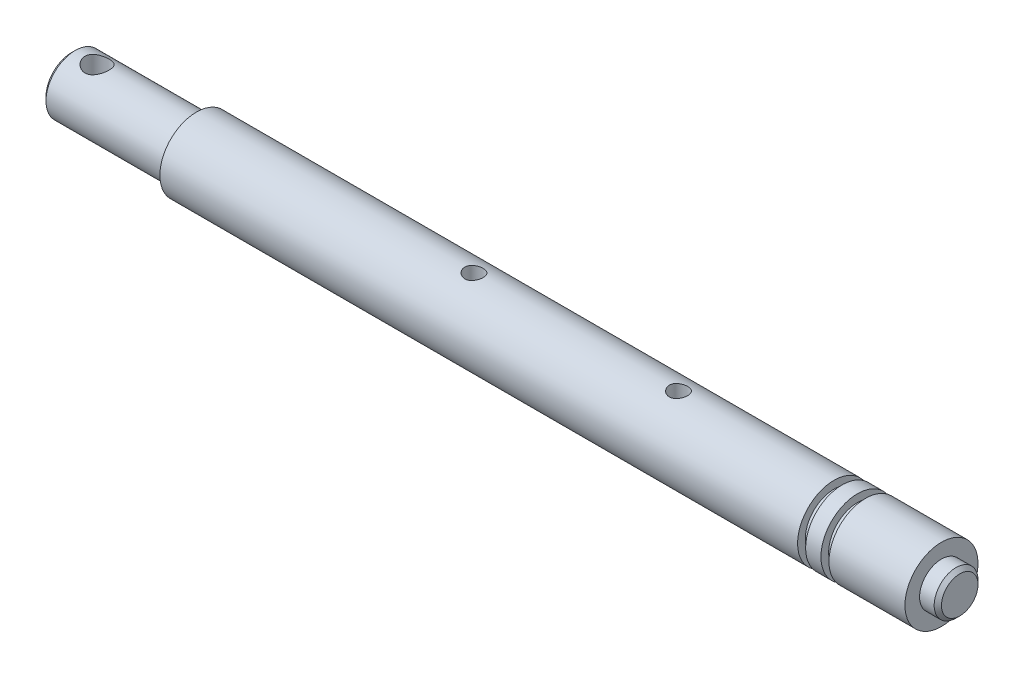
ISO-10303-21;
HEADER;
FILE_DESCRIPTION(('STEP AP214'),'2;1');
FILE_NAME('part.step','',(''),(''),'','','');
FILE_SCHEMA(('AUTOMOTIVE_DESIGN { 1 0 10303 214 1 1 1 1 }'));
ENDSEC;
DATA;
#1=APPLICATION_CONTEXT('core data for automotive mechanical design processes');
#2=APPLICATION_PROTOCOL_DEFINITION('international standard','automotive_design',2000,#1);
#3=PRODUCT_CONTEXT('',#1,'mechanical');
#4=PRODUCT('Part','Part','',(#3));
#5=PRODUCT_RELATED_PRODUCT_CATEGORY('part','',(#4));
#6=PRODUCT_DEFINITION_FORMATION('','',#4);
#7=PRODUCT_DEFINITION_CONTEXT('part definition',#1,'design');
#8=PRODUCT_DEFINITION('design','',#6,#7);
#9=PRODUCT_DEFINITION_SHAPE('','',#8);
#10=(LENGTH_UNIT() NAMED_UNIT(*) SI_UNIT(.MILLI.,.METRE.));
#11=(NAMED_UNIT(*) PLANE_ANGLE_UNIT() SI_UNIT($,.RADIAN.));
#12=(NAMED_UNIT(*) SI_UNIT($,.STERADIAN.) SOLID_ANGLE_UNIT());
#13=UNCERTAINTY_MEASURE_WITH_UNIT(LENGTH_MEASURE(1.E-05),#10,'distance_accuracy_value','');
#14=(GEOMETRIC_REPRESENTATION_CONTEXT(3) GLOBAL_UNCERTAINTY_ASSIGNED_CONTEXT((#13)) GLOBAL_UNIT_ASSIGNED_CONTEXT((#10,
#11,#12)) REPRESENTATION_CONTEXT('',''));
#15=CARTESIAN_POINT('',(0.,0.,0.));
#16=DIRECTION('',(0.,0.,1.));
#17=DIRECTION('',(1.,0.,0.));
#18=AXIS2_PLACEMENT_3D('',#15,#16,#17);
#19=CARTESIAN_POINT('',(17.1,0.,0.));
#20=DIRECTION('',(-1.,0.,0.));
#21=DIRECTION('',(0.,0.,1.));
#22=AXIS2_PLACEMENT_3D('',#19,#20,#21);
#23=CYLINDRICAL_SURFACE('',#22,4.);
#24=CARTESIAN_POINT('',(0.499999999999997,0.,0.));
#25=DIRECTION('',(1.,0.,0.));
#26=DIRECTION('',(0.,0.,-1.));
#27=AXIS2_PLACEMENT_3D('',#24,#25,#26);
#28=CIRCLE('',#27,4.);
#29=CARTESIAN_POINT('',(0.499999999999997,0.,-4.));
#30=VERTEX_POINT('',#29);
#31=EDGE_CURVE('E138',#30,#30,#28,.T.);
#32=ORIENTED_EDGE('',*,*,#31,.T.);
#33=EDGE_LOOP('',(#32));
#34=FACE_BOUND('',#33,.T.);
#35=CARTESIAN_POINT('',(3.5,-3.64383040220041,1.65));
#36=CARTESIAN_POINT('',(3.58809648022568,-3.64383945275153,1.64999056813102));
#37=CARTESIAN_POINT('',(3.67634043197359,-3.64707173267573,1.64289989177358));
#38=CARTESIAN_POINT('',(3.85028706107888,-3.65959209124688,1.61480845546373));
#39=CARTESIAN_POINT('',(3.9359821005976,-3.66889676295874,1.5937695789634));
#40=CARTESIAN_POINT('',(4.10200293813063,-3.69231325052125,1.53873536249638));
#41=CARTESIAN_POINT('',(4.1823488202186,-3.70640571161012,1.50479212400174));
#42=CARTESIAN_POINT('',(4.33618176683423,-3.73778230052357,1.42506535594207));
#43=CARTESIAN_POINT('',(4.40967054278404,-3.75506562873472,1.37928479159595));
#44=CARTESIAN_POINT('',(4.5522286878465,-3.7920553041855,1.27419856290372));
#45=CARTESIAN_POINT('',(4.62082925578021,-3.81184277704779,1.2142851824136));
#46=CARTESIAN_POINT('',(4.74735477190876,-3.85094363418238,1.08391072165483));
#47=CARTESIAN_POINT('',(4.80527565147223,-3.87025683535296,1.01344563996364));
#48=CARTESIAN_POINT('',(4.91117137130187,-3.90721575035942,0.860301943593382));
#49=CARTESIAN_POINT('',(4.95862093270616,-3.92475616703248,0.777232390113591));
#50=CARTESIAN_POINT('',(5.0386701453217,-3.95520283117798,0.603436361875857));
#51=CARTESIAN_POINT('',(5.07127626434656,-3.96811109652272,0.512713242513045));
#52=CARTESIAN_POINT('',(5.11902070665623,-3.98726403378776,0.331105172304398));
#53=CARTESIAN_POINT('',(5.13496684792324,-3.99381564337609,0.240465625184492));
#54=CARTESIAN_POINT('',(5.15154665185517,-4.0006306156112,0.0575763551498653));
#55=CARTESIAN_POINT('',(5.15218639532201,-4.00089647540932,-0.0346727137709551));
#56=CARTESIAN_POINT('',(5.13856350386341,-3.99529224160632,-0.212297380895985));
#57=CARTESIAN_POINT('',(5.1251878162829,-3.98978733384658,-0.297754665400397));
#58=CARTESIAN_POINT('',(5.08543118255224,-3.97375926025944,-0.465085845235279));
#59=CARTESIAN_POINT('',(5.05904927870932,-3.96323572489496,-0.546959476205493));
#60=CARTESIAN_POINT('',(4.99371233827982,-3.93798907731603,-0.70629560681723));
#61=CARTESIAN_POINT('',(4.95457201007513,-3.92320447216362,-0.78367197976247));
#62=CARTESIAN_POINT('',(4.8650087208134,-3.89088763760773,-0.930960489992467));
#63=CARTESIAN_POINT('',(4.8145817994967,-3.87335444442336,-1.00086999453932));
#64=CARTESIAN_POINT('',(4.69981176097137,-3.83587133640027,-1.13638530947041));
#65=CARTESIAN_POINT('',(4.63474658910128,-3.8158381454309,-1.20135746318645));
#66=CARTESIAN_POINT('',(4.49459033367843,-3.77653142784555,-1.31973838423493));
#67=CARTESIAN_POINT('',(4.4194955507367,-3.75725818494773,-1.37314286572202));
#68=CARTESIAN_POINT('',(4.25840159645269,-3.72106607156909,-1.46845339844828));
#69=CARTESIAN_POINT('',(4.17213242830735,-3.70424107982558,-1.50994179309277));
#70=CARTESIAN_POINT('',(3.99295332859411,-3.67596385006485,-1.57754508127096));
#71=CARTESIAN_POINT('',(3.90004808612619,-3.66450786071417,-1.60367071206121));
#72=CARTESIAN_POINT('',(3.71657710481502,-3.64919091711418,-1.63821320355942));
#73=CARTESIAN_POINT('',(3.62624169881714,-3.64489111171831,-1.64765569454682));
#74=CARTESIAN_POINT('',(3.4451943703014,-3.64311980380967,-1.65157101672826));
#75=CARTESIAN_POINT('',(3.35448258394072,-3.64564601607449,-1.64604885780402));
#76=CARTESIAN_POINT('',(3.18119899095053,-3.65678944366161,-1.62112710501827));
#77=CARTESIAN_POINT('',(3.09847182032539,-3.66501803861664,-1.60261202118543));
#78=CARTESIAN_POINT('',(2.93736293562003,-3.68614612916707,-1.55339580262015));
#79=CARTESIAN_POINT('',(2.85898222864834,-3.69904670212356,-1.52269185697123));
#80=CARTESIAN_POINT('',(2.70512099430436,-3.72872477858182,-1.44853902204985));
#81=CARTESIAN_POINT('',(2.62989980522076,-3.74564214050945,-1.40460979308264));
#82=CARTESIAN_POINT('',(2.48753983057027,-3.78124523189864,-1.30573455409451));
#83=CARTESIAN_POINT('',(2.42040451226488,-3.79993171387674,-1.25078384473684));
#84=CARTESIAN_POINT('',(2.29057037355329,-3.83876011670653,-1.12627542162099));
#85=CARTESIAN_POINT('',(2.22864826295128,-3.85889967217623,-1.05590387126704));
#86=CARTESIAN_POINT('',(2.11735714433793,-3.89698114804694,-0.905297980080105));
#87=CARTESIAN_POINT('',(2.0679889479968,-3.91492292631236,-0.825063002026905));
#88=CARTESIAN_POINT('',(1.98329586579321,-3.94668767391886,-0.656516816883269));
#89=CARTESIAN_POINT('',(1.94799652499727,-3.96050313975064,-0.568191273870494));
#90=CARTESIAN_POINT('',(1.89300834314125,-3.98237104121021,-0.386140833605179));
#91=CARTESIAN_POINT('',(1.87331041706106,-3.9904268305481,-0.292419112817562));
#92=CARTESIAN_POINT('',(1.85121177107952,-3.9994889299446,-0.109187189544838));
#93=CARTESIAN_POINT('',(1.84771517125806,-4.00094173424749,-0.0198303081186372));
#94=CARTESIAN_POINT('',(1.85518543437028,-3.99786220239438,0.15816173919541));
#95=CARTESIAN_POINT('',(1.86614984999545,-3.99333087896147,0.246797024648478));
#96=CARTESIAN_POINT('',(1.90144464213556,-3.979024148364,0.417705375935875));
#97=CARTESIAN_POINT('',(1.92530444211455,-3.96943363922013,0.50009237162785));
#98=CARTESIAN_POINT('',(1.98520411487999,-3.94605480923816,0.659667355734159));
#99=CARTESIAN_POINT('',(2.02124632478668,-3.93226568297163,0.736854343148743));
#100=CARTESIAN_POINT('',(2.10630452668639,-3.90105808483759,0.887661133732618));
#101=CARTESIAN_POINT('',(2.15583125677293,-3.88350423911689,0.960964214361149));
#102=CARTESIAN_POINT('',(2.26570284679,-3.84685709666619,1.09852932170704));
#103=CARTESIAN_POINT('',(2.32605162308081,-3.82776324400832,1.1627880603165));
#104=CARTESIAN_POINT('',(2.46058752735466,-3.78859741195738,1.28487769945047));
#105=CARTESIAN_POINT('',(2.53542775688494,-3.76854475207571,1.34199767947157));
#106=CARTESIAN_POINT('',(2.69426597568106,-3.73105419200534,1.4429647467733));
#107=CARTESIAN_POINT('',(2.77826899170959,-3.7136177396712,1.48680449811903));
#108=CARTESIAN_POINT('',(2.95272844126989,-3.68370387904713,1.55944447766651));
#109=CARTESIAN_POINT('',(3.0431391080911,-3.67119480418034,1.58834112875234));
#110=CARTESIAN_POINT('',(3.22804714407836,-3.65281837075147,1.63017263567573));
#111=CARTESIAN_POINT('',(3.32252969087687,-3.64692873900432,1.64316103312974));
#112=CARTESIAN_POINT('',(3.44486331364264,-3.64414054419779,1.6493120932942));
#113=CARTESIAN_POINT('',(3.47242443228502,-3.64382756923722,1.6500029523216));
#114=CARTESIAN_POINT('',(3.5,-3.64383040220041,1.65));
#115=B_SPLINE_CURVE_WITH_KNOTS('',3,(#35,#36,#37,#38,#39,#40,#41,#42,#43,#44,#45,#46,#47,#48,
#49,#50,#51,#52,#53,#54,#55,#56,#57,#58,#59,#60,#61,#62,#63,#64,#65,#66,#67,#68,#69,#70,#71,#72,
#73,#74,#75,#76,#77,#78,#79,#80,#81,#82,#83,#84,#85,#86,#87,#88,#89,#90,#91,#92,#93,#94,#95,#96,
#97,#98,#99,#100,#101,#102,#103,#104,#105,#106,#107,#108,#109,#110,#111,#112,#113,#114),
.UNSPECIFIED.,.T.,.F.,(4,2,2,2,2,2,2,2,2,2,2,2,2,2,2,2,2,2,2,2,2,2,2,2,2,2,2,2,2,2,2,2,2,2,2,2,
2,2,2,4),(0.,0.264211724660745,0.529148459018597,0.793026677872049,1.05683885985756,
1.33523297260792,1.6137329267621,1.90403076094908,2.19420198072699,2.4695381624427,
2.74476495901024,3.00356896819766,3.26239203686791,3.5251552692474,3.78801084539546,
4.06907613148064,4.35024537535724,4.64031806272423,4.9301877724111,5.20152035698263,
5.47276211576042,5.72713321026166,5.98156300028881,6.24665916965708,6.51186861189123,
6.79815687284347,7.08446363898863,7.37128791456171,7.65794504349151,7.92489841526079,
8.19180661499935,8.44957452423759,8.70739191275388,8.97680852354695,9.24632283025307,
9.53374725602175,9.82133016535516,10.1070334851925,10.3917725616094,10.4744749384332),.UNSPECIFIED.);
#116=CARTESIAN_POINT('',(3.5,-3.64383040220041,1.65));
#117=VERTEX_POINT('',#116);
#118=EDGE_CURVE('E131',#117,#117,#115,.T.);
#119=ORIENTED_EDGE('',*,*,#118,.T.);
#120=EDGE_LOOP('',(#119));
#121=FACE_BOUND('',#120,.T.);
#122=CARTESIAN_POINT('',(3.5,3.64383040220041,1.65));
#123=CARTESIAN_POINT('',(3.41190351977432,3.64383945275153,1.64999056813102));
#124=CARTESIAN_POINT('',(3.32365956802641,3.64707173267573,1.64289989177358));
#125=CARTESIAN_POINT('',(3.14971293892112,3.65959209124688,1.61480845546373));
#126=CARTESIAN_POINT('',(3.0640178994024,3.66889676295874,1.5937695789634));
#127=CARTESIAN_POINT('',(2.89799706186937,3.69231325052125,1.53873536249638));
#128=CARTESIAN_POINT('',(2.8176511797814,3.70640571161012,1.50479212400174));
#129=CARTESIAN_POINT('',(2.66381823316578,3.73778230052357,1.42506535594207));
#130=CARTESIAN_POINT('',(2.59032945721596,3.75506562873472,1.37928479159595));
#131=CARTESIAN_POINT('',(2.4477713121535,3.7920553041855,1.27419856290372));
#132=CARTESIAN_POINT('',(2.37917074421979,3.81184277704779,1.2142851824136));
#133=CARTESIAN_POINT('',(2.25264522809124,3.85094363418238,1.08391072165483));
#134=CARTESIAN_POINT('',(2.19472434852778,3.87025683535296,1.01344563996364));
#135=CARTESIAN_POINT('',(2.08882862869813,3.90721575035942,0.860301943593382));
#136=CARTESIAN_POINT('',(2.04137906729384,3.92475616703248,0.777232390113591));
#137=CARTESIAN_POINT('',(1.9613298546783,3.95520283117798,0.603436361875858));
#138=CARTESIAN_POINT('',(1.92872373565344,3.96811109652272,0.512713242513045));
#139=CARTESIAN_POINT('',(1.88097929334377,3.98726403378776,0.331105172304399));
#140=CARTESIAN_POINT('',(1.86503315207676,3.99381564337609,0.240465625184493));
#141=CARTESIAN_POINT('',(1.84845334814483,4.0006306156112,0.0575763551498655));
#142=CARTESIAN_POINT('',(1.84781360467799,4.00089647540932,-0.0346727137709551));
#143=CARTESIAN_POINT('',(1.86143649613659,3.99529224160632,-0.212297380895985));
#144=CARTESIAN_POINT('',(1.8748121837171,3.98978733384658,-0.297754665400397));
#145=CARTESIAN_POINT('',(1.91456881744776,3.97375926025944,-0.465085845235279));
#146=CARTESIAN_POINT('',(1.94095072129068,3.96323572489496,-0.546959476205493));
#147=CARTESIAN_POINT('',(2.00628766172018,3.93798907731603,-0.70629560681723));
#148=CARTESIAN_POINT('',(2.04542798992487,3.92320447216362,-0.78367197976247));
#149=CARTESIAN_POINT('',(2.1349912791866,3.89088763760773,-0.930960489992467));
#150=CARTESIAN_POINT('',(2.1854182005033,3.87335444442336,-1.00086999453932));
#151=CARTESIAN_POINT('',(2.30018823902863,3.83587133640027,-1.13638530947041));
#152=CARTESIAN_POINT('',(2.36525341089872,3.8158381454309,-1.20135746318645));
#153=CARTESIAN_POINT('',(2.50540966632157,3.77653142784555,-1.31973838423493));
#154=CARTESIAN_POINT('',(2.5805044492633,3.75725818494773,-1.37314286572202));
#155=CARTESIAN_POINT('',(2.74159840354731,3.72106607156909,-1.46845339844828));
#156=CARTESIAN_POINT('',(2.82786757169265,3.70424107982558,-1.50994179309277));
#157=CARTESIAN_POINT('',(3.00704667140589,3.67596385006485,-1.57754508127096));
#158=CARTESIAN_POINT('',(3.09995191387381,3.66450786071417,-1.60367071206121));
#159=CARTESIAN_POINT('',(3.28342289518498,3.64919091711418,-1.63821320355942));
#160=CARTESIAN_POINT('',(3.37375830118286,3.64489111171831,-1.64765569454682));
#161=CARTESIAN_POINT('',(3.5548056296986,3.64311980380967,-1.65157101672826));
#162=CARTESIAN_POINT('',(3.64551741605928,3.64564601607449,-1.64604885780402));
#163=CARTESIAN_POINT('',(3.81880100904947,3.65678944366161,-1.62112710501827));
#164=CARTESIAN_POINT('',(3.90152817967461,3.66501803861664,-1.60261202118543));
#165=CARTESIAN_POINT('',(4.06263706437997,3.68614612916707,-1.55339580262015));
#166=CARTESIAN_POINT('',(4.14101777135166,3.69904670212356,-1.52269185697123));
#167=CARTESIAN_POINT('',(4.29487900569563,3.72872477858182,-1.44853902204985));
#168=CARTESIAN_POINT('',(4.37010019477924,3.74564214050945,-1.40460979308264));
#169=CARTESIAN_POINT('',(4.51246016942973,3.78124523189864,-1.30573455409451));
#170=CARTESIAN_POINT('',(4.57959548773512,3.79993171387674,-1.25078384473684));
#171=CARTESIAN_POINT('',(4.70942962644671,3.83876011670653,-1.12627542162099));
#172=CARTESIAN_POINT('',(4.77135173704872,3.85889967217623,-1.05590387126704));
#173=CARTESIAN_POINT('',(4.88264285566207,3.89698114804694,-0.905297980080106));
#174=CARTESIAN_POINT('',(4.9320110520032,3.91492292631236,-0.825063002026906));
#175=CARTESIAN_POINT('',(5.01670413420679,3.94668767391886,-0.65651681688327));
#176=CARTESIAN_POINT('',(5.05200347500273,3.96050313975064,-0.568191273870494));
#177=CARTESIAN_POINT('',(5.10699165685875,3.98237104121021,-0.38614083360518));
#178=CARTESIAN_POINT('',(5.12668958293894,3.9904268305481,-0.292419112817563));
#179=CARTESIAN_POINT('',(5.14878822892048,3.9994889299446,-0.109187189544839));
#180=CARTESIAN_POINT('',(5.15228482874194,4.00094173424749,-0.0198303081186387));
#181=CARTESIAN_POINT('',(5.14481456562972,3.99786220239438,0.158161739195408));
#182=CARTESIAN_POINT('',(5.13385015000455,3.99333087896147,0.246797024648477));
#183=CARTESIAN_POINT('',(5.09855535786444,3.979024148364,0.417705375935874));
#184=CARTESIAN_POINT('',(5.07469555788545,3.96943363922013,0.500092371627849));
#185=CARTESIAN_POINT('',(5.01479588512001,3.94605480923816,0.659667355734158));
#186=CARTESIAN_POINT('',(4.97875367521332,3.93226568297163,0.736854343148742));
#187=CARTESIAN_POINT('',(4.89369547331361,3.90105808483759,0.887661133732617));
#188=CARTESIAN_POINT('',(4.84416874322707,3.88350423911689,0.960964214361148));
#189=CARTESIAN_POINT('',(4.73429715321,3.84685709666619,1.09852932170704));
#190=CARTESIAN_POINT('',(4.67394837691919,3.82776324400832,1.1627880603165));
#191=CARTESIAN_POINT('',(4.53941247264534,3.78859741195738,1.28487769945047));
#192=CARTESIAN_POINT('',(4.46457224311506,3.76854475207571,1.34199767947157));
#193=CARTESIAN_POINT('',(4.30573402431894,3.73105419200534,1.4429647467733));
#194=CARTESIAN_POINT('',(4.22173100829041,3.7136177396712,1.48680449811903));
#195=CARTESIAN_POINT('',(4.04727155873011,3.68370387904713,1.55944447766651));
#196=CARTESIAN_POINT('',(3.95686089190891,3.67119480418034,1.58834112875234));
#197=CARTESIAN_POINT('',(3.77195285592164,3.65281837075147,1.63017263567573));
#198=CARTESIAN_POINT('',(3.67747030912313,3.64692873900432,1.64316103312974));
#199=CARTESIAN_POINT('',(3.55513668635736,3.64414054419779,1.6493120932942));
#200=CARTESIAN_POINT('',(3.52757556771498,3.64382756923722,1.6500029523216));
#201=CARTESIAN_POINT('',(3.5,3.64383040220041,1.65));
#202=B_SPLINE_CURVE_WITH_KNOTS('',3,(#122,#123,#124,#125,#126,#127,#128,#129,#130,#131,#132,
#133,#134,#135,#136,#137,#138,#139,#140,#141,#142,#143,#144,#145,#146,#147,#148,#149,#150,#151,
#152,#153,#154,#155,#156,#157,#158,#159,#160,#161,#162,#163,#164,#165,#166,#167,#168,#169,#170,
#171,#172,#173,#174,#175,#176,#177,#178,#179,#180,#181,#182,#183,#184,#185,#186,#187,#188,#189,
#190,#191,#192,#193,#194,#195,#196,#197,#198,#199,#200,#201),.UNSPECIFIED.,.T.,.F.,(4,2,2,2,2,2,
2,2,2,2,2,2,2,2,2,2,2,2,2,2,2,2,2,2,2,2,2,2,2,2,2,2,2,2,2,2,2,2,2,4),(0.,0.264211724660744,
0.529148459018597,0.793026677872048,1.05683885985756,1.33523297260792,1.61373292676209,
1.90403076094908,2.19420198072699,2.4695381624427,2.74476495901024,3.00356896819766,
3.26239203686791,3.5251552692474,3.78801084539546,4.06907613148064,4.35024537535724,
4.64031806272423,4.9301877724111,5.20152035698263,5.47276211576042,5.72713321026166,
5.98156300028881,6.24665916965708,6.51186861189123,6.79815687284347,7.08446363898863,
7.37128791456171,7.65794504349151,7.92489841526079,8.19180661499935,8.44957452423759,
8.70739191275388,8.97680852354695,9.24632283025307,9.53374725602175,9.82133016535516,
10.1070334851925,10.3917725616094,10.4744749384332),.UNSPECIFIED.);
#203=CARTESIAN_POINT('',(3.5,3.64383040220041,1.65));
#204=VERTEX_POINT('',#203);
#205=EDGE_CURVE('E124',#204,#204,#202,.T.);
#206=ORIENTED_EDGE('',*,*,#205,.T.);
#207=EDGE_LOOP('',(#206));
#208=FACE_BOUND('',#207,.T.);
#209=CARTESIAN_POINT('',(17.1,0.,0.));
#210=DIRECTION('',(1.,0.,0.));
#211=DIRECTION('',(0.,0.,-1.));
#212=AXIS2_PLACEMENT_3D('',#209,#210,#211);
#213=CIRCLE('',#212,4.);
#214=CARTESIAN_POINT('',(17.1,0.,-4.));
#215=VERTEX_POINT('',#214);
#216=EDGE_CURVE('E164',#215,#215,#213,.T.);
#217=ORIENTED_EDGE('',*,*,#216,.F.);
#218=EDGE_LOOP('',(#217));
#219=FACE_BOUND('',#218,.T.);
#220=ADVANCED_FACE('F49',(#34,#121,#208,#219),#23,.T.);
#221=CARTESIAN_POINT('',(0.,0.,0.));
#222=DIRECTION('',(1.,0.,0.));
#223=DIRECTION('',(0.,0.,-1.));
#224=AXIS2_PLACEMENT_3D('',#221,#222,#223);
#225=PLANE('',#224);
#226=CARTESIAN_POINT('',(0.,0.,0.));
#227=DIRECTION('',(1.,0.,0.));
#228=DIRECTION('',(0.,0.,-1.));
#229=AXIS2_PLACEMENT_3D('',#226,#227,#228);
#230=CIRCLE('',#229,3.5);
#231=CARTESIAN_POINT('',(0.,0.,-3.5));
#232=VERTEX_POINT('',#231);
#233=EDGE_CURVE('E159',#232,#232,#230,.F.);
#234=ORIENTED_EDGE('',*,*,#233,.T.);
#235=EDGE_LOOP('',(#234));
#236=FACE_BOUND('',#235,.T.);
#237=ADVANCED_FACE('F142',(#236),#225,.F.);
#238=CARTESIAN_POINT('',(17.1,0.,0.));
#239=DIRECTION('',(1.,0.,0.));
#240=DIRECTION('',(0.,0.,-1.));
#241=AXIS2_PLACEMENT_3D('',#238,#239,#240);
#242=PLANE('',#241);
#243=ORIENTED_EDGE('',*,*,#216,.T.);
#244=EDGE_LOOP('',(#243));
#245=FACE_BOUND('',#244,.T.);
#246=CARTESIAN_POINT('',(17.1,0.,0.));
#247=DIRECTION('',(1.,0.,0.));
#248=DIRECTION('',(0.,0.,-1.));
#249=AXIS2_PLACEMENT_3D('',#246,#247,#248);
#250=CIRCLE('',#249,5.);
#251=CARTESIAN_POINT('',(17.1,0.,-5.));
#252=VERTEX_POINT('',#251);
#253=EDGE_CURVE('E137',#252,#252,#250,.T.);
#254=ORIENTED_EDGE('',*,*,#253,.F.);
#255=EDGE_LOOP('',(#254));
#256=FACE_BOUND('',#255,.T.);
#257=ADVANCED_FACE('F203',(#245,#256),#242,.F.);
#258=CARTESIAN_POINT('',(133.242135623731,0.,0.));
#259=DIRECTION('',(-1.,0.,0.));
#260=DIRECTION('',(0.,0.,1.));
#261=AXIS2_PLACEMENT_3D('',#258,#259,#260);
#262=CYLINDRICAL_SURFACE('',#261,5.);
#263=CARTESIAN_POINT('',(83.1,4.84122918275927,1.25));
#264=CARTESIAN_POINT('',(83.0309746245377,4.84123050042654,1.24999803929589));
#265=CARTESIAN_POINT('',(82.961927550661,4.84272153006957,1.24426312274865));
#266=CARTESIAN_POINT('',(82.825816210913,4.84850930996624,1.22151156273207));
#267=CARTESIAN_POINT('',(82.7587531227658,4.85280769310907,1.2044883533711));
#268=CARTESIAN_POINT('',(82.6285982309065,4.86369362297984,1.15974559981597));
#269=CARTESIAN_POINT('',(82.5655014223072,4.87027821345204,1.13203986392723));
#270=CARTESIAN_POINT('',(82.44484457373,4.88499096014404,1.06676057063071));
#271=CARTESIAN_POINT('',(82.3872847689599,4.89311918189251,1.02918659428035));
#272=CARTESIAN_POINT('',(82.2780691773689,4.91020358177806,0.94435421365594));
#273=CARTESIAN_POINT('',(82.226553199825,4.91917298811515,0.896918443852028));
#274=CARTESIAN_POINT('',(82.1321193028198,4.93681437757649,0.794091032050334));
#275=CARTESIAN_POINT('',(82.0892021871891,4.94548633283195,0.738698647090153));
#276=CARTESIAN_POINT('',(82.0126122661844,4.96170207760291,0.620572600539475));
#277=CARTESIAN_POINT('',(81.9790768059193,4.96922843700296,0.557747288097559));
#278=CARTESIAN_POINT('',(81.9230951779235,4.98215405962992,0.427131592146385));
#279=CARTESIAN_POINT('',(81.9006473740422,4.98755363667172,0.359341942895978));
#280=CARTESIAN_POINT('',(81.8679260827107,4.9955237942409,0.222179379377092));
#281=CARTESIAN_POINT('',(81.8574151778367,4.99814946922157,0.152866359774498));
#282=CARTESIAN_POINT('',(81.8481208103622,5.00046797053649,0.013414409631393));
#283=CARTESIAN_POINT('',(81.8493356138952,5.00016123048352,-0.0567243972690267));
#284=CARTESIAN_POINT('',(81.8632874251251,4.99669047476767,-0.194190308965477));
#285=CARTESIAN_POINT('',(81.8757681625269,4.99359001170437,-0.261545269501327));
#286=CARTESIAN_POINT('',(81.9114856350242,4.98495418262427,-0.393172809267101));
#287=CARTESIAN_POINT('',(81.9347229426887,4.9794186869922,-0.457445224213041));
#288=CARTESIAN_POINT('',(81.9915012853435,4.96643754850448,-0.581758379377252));
#289=CARTESIAN_POINT('',(82.0251335223309,4.95897509847527,-0.641755637208124));
#290=CARTESIAN_POINT('',(82.1016778395581,4.94294951904825,-0.755344527925603));
#291=CARTESIAN_POINT('',(82.1445915342803,4.93438619826245,-0.808935043856873));
#292=CARTESIAN_POINT('',(82.2398543709912,4.9168185688476,-0.909717543856185));
#293=CARTESIAN_POINT('',(82.2924274461739,4.90780859762959,-0.956697098843988));
#294=CARTESIAN_POINT('',(82.4047999867701,4.89057521758353,-1.04122046995376));
#295=CARTESIAN_POINT('',(82.4645997897455,4.88235184552985,-1.07876384505751));
#296=CARTESIAN_POINT('',(82.5901450170745,4.86760248415824,-1.14348516127824));
#297=CARTESIAN_POINT('',(82.6559178651566,4.8610849186286,-1.17061195871311));
#298=CARTESIAN_POINT('',(82.7912927340382,4.85059320069979,-1.21335702579542));
#299=CARTESIAN_POINT('',(82.8608939319916,4.84661850405109,-1.22897775819113));
#300=CARTESIAN_POINT('',(82.9999797507616,4.8417767801957,-1.24791481933258));
#301=CARTESIAN_POINT('',(83.0694188966648,4.84083044546824,-1.25154523695981));
#302=CARTESIAN_POINT('',(83.2079109682891,4.8419367174052,-1.24725849525777));
#303=CARTESIAN_POINT('',(83.2769639289756,4.84398904800633,-1.2393423989244));
#304=CARTESIAN_POINT('',(83.4115571324773,4.8507854097728,-1.21246273196883));
#305=CARTESIAN_POINT('',(83.4771363632854,4.85548485117187,-1.19368203414087));
#306=CARTESIAN_POINT('',(83.6042157289258,4.86700359135481,-1.14580904083531));
#307=CARTESIAN_POINT('',(83.6657153795276,4.87382314124307,-1.11671552385628));
#308=CARTESIAN_POINT('',(83.7842206389336,4.88898068546631,-1.04838533396828));
#309=CARTESIAN_POINT('',(83.8411144200215,4.89734584303321,-1.00896087691782));
#310=CARTESIAN_POINT('',(83.9475941814007,4.91458541535858,-0.921325366168075));
#311=CARTESIAN_POINT('',(83.997178958325,4.92345991364235,-0.873112868506804));
#312=CARTESIAN_POINT('',(84.0889055212855,4.94098701515803,-0.76782840123091));
#313=CARTESIAN_POINT('',(84.1308300312744,4.94962851030918,-0.710564940664492));
#314=CARTESIAN_POINT('',(84.2044679334756,4.96548608306867,-0.589628353368344));
#315=CARTESIAN_POINT('',(84.2361818583041,4.9727022350198,-0.525955561196988));
#316=CARTESIAN_POINT('',(84.2882230172639,4.98485057869157,-0.394447752163862));
#317=CARTESIAN_POINT('',(84.3086321421895,4.98979915011205,-0.326646726284851));
#318=CARTESIAN_POINT('',(84.3377301673042,4.99692646697894,-0.188437200398512));
#319=CARTESIAN_POINT('',(84.3464213293695,4.99910574696704,-0.118029206301559));
#320=CARTESIAN_POINT('',(84.3517094869694,5.00042711761014,0.0213544080541503));
#321=CARTESIAN_POINT('',(84.3486271363692,4.9996497360001,0.0903172837075327));
#322=CARTESIAN_POINT('',(84.3311902158821,4.9953237057178,0.226709370518416));
#323=CARTESIAN_POINT('',(84.3168359812336,4.99177513946369,0.294138627226101));
#324=CARTESIAN_POINT('',(84.2774347252863,4.98231791067453,0.425213794556011));
#325=CARTESIAN_POINT('',(84.2524456833567,4.97642205628333,0.488878118226262));
#326=CARTESIAN_POINT('',(84.1925367762258,4.9628911114173,0.611146316301824));
#327=CARTESIAN_POINT('',(84.157615659163,4.9552558017217,0.669749551581306));
#328=CARTESIAN_POINT('',(84.0778559575037,4.93884062101666,0.78175241052987));
#329=CARTESIAN_POINT('',(84.0327998213658,4.93003771182014,0.834993735375727));
#330=CARTESIAN_POINT('',(83.9344714350327,4.91238311316553,0.933268775339064));
#331=CARTESIAN_POINT('',(83.8811971048776,4.90353141190695,0.978300406335231));
#332=CARTESIAN_POINT('',(83.7667482322483,4.88659344825685,1.05970253309903));
#333=CARTESIAN_POINT('',(83.7054448457342,4.87852454662356,1.09589577430818));
#334=CARTESIAN_POINT('',(83.5774306375966,4.8642994443827,1.15740862076958));
#335=CARTESIAN_POINT('',(83.5107237923666,4.85814185308378,1.18273613719965));
#336=CARTESIAN_POINT('',(83.3867787352166,4.84939885924729,1.2180281607068));
#337=CARTESIAN_POINT('',(83.3301335445202,4.84635828750683,1.22999146324422));
#338=CARTESIAN_POINT('',(83.21566391375,4.84227298231965,1.24597786571658));
#339=CARTESIAN_POINT('',(83.1578395746937,4.84122807862454,1.25000164296523));
#340=CARTESIAN_POINT('',(83.1,4.84122918275927,1.25));
#341=B_SPLINE_CURVE_WITH_KNOTS('',3,(#263,#264,#265,#266,#267,#268,#269,#270,#271,#272,#273,
#274,#275,#276,#277,#278,#279,#280,#281,#282,#283,#284,#285,#286,#287,#288,#289,#290,#291,#292,
#293,#294,#295,#296,#297,#298,#299,#300,#301,#302,#303,#304,#305,#306,#307,#308,#309,#310,#311,
#312,#313,#314,#315,#316,#317,#318,#319,#320,#321,#322,#323,#324,#325,#326,#327,#328,#329,#330,
#331,#332,#333,#334,#335,#336,#337,#338,#339,#340),.UNSPECIFIED.,.T.,.F.,(4,2,2,2,2,2,2,2,2,2,2,
2,2,2,2,2,2,2,2,2,2,2,2,2,2,2,2,2,2,2,2,2,2,2,2,2,2,2,4),(0.,0.206863720868075,
0.413847870714327,0.620565363582996,0.827291633777384,1.03811977096488,1.24896760739933,
1.46275748198959,1.67651579923545,1.88594375497672,2.09534074333009,2.30009131344472,
2.50485278362392,2.71146437127221,2.91811192734455,3.13035233285954,3.342602655999,
3.55588216004201,3.76911600064773,3.97671787380857,4.184300635919,4.38848702504601,
4.59269760710706,4.80091422929577,5.00916509442521,5.22262665482658,5.43607707859776,
5.64796036403464,5.85980274454517,6.06591723063726,6.27202558688489,6.47702438279853,
6.68204902869034,6.89198548291034,7.10197515782753,7.31588238642337,7.52963360683308,
7.70298913588663,7.87632987549759),.UNSPECIFIED.);
#342=CARTESIAN_POINT('',(83.1,4.84122918275927,1.25));
#343=VERTEX_POINT('',#342);
#344=EDGE_CURVE('E10',#343,#343,#341,.T.);
#345=ORIENTED_EDGE('',*,*,#344,.T.);
#346=EDGE_LOOP('',(#345));
#347=FACE_BOUND('',#346,.T.);
#348=CARTESIAN_POINT('',(55.1,4.84122918275927,1.25));
#349=CARTESIAN_POINT('',(55.0309746245377,4.84123050042654,1.24999803929589));
#350=CARTESIAN_POINT('',(54.961927550661,4.84272153006957,1.24426312274865));
#351=CARTESIAN_POINT('',(54.825816210913,4.84850930996624,1.22151156273207));
#352=CARTESIAN_POINT('',(54.7587531227658,4.85280769310907,1.2044883533711));
#353=CARTESIAN_POINT('',(54.6285982309065,4.86369362297984,1.15974559981597));
#354=CARTESIAN_POINT('',(54.5655014223072,4.87027821345204,1.13203986392723));
#355=CARTESIAN_POINT('',(54.44484457373,4.88499096014404,1.0667605706307));
#356=CARTESIAN_POINT('',(54.3872847689599,4.89311918189251,1.02918659428034));
#357=CARTESIAN_POINT('',(54.2780691773689,4.91020358177806,0.944354213655939));
#358=CARTESIAN_POINT('',(54.226553199825,4.91917298811515,0.896918443852027));
#359=CARTESIAN_POINT('',(54.1321193028198,4.93681437757649,0.794091032050336));
#360=CARTESIAN_POINT('',(54.0892021871891,4.94548633283195,0.738698647090158));
#361=CARTESIAN_POINT('',(54.0126122661844,4.96170207760291,0.620572600539483));
#362=CARTESIAN_POINT('',(53.9790768059193,4.96922843700296,0.557747288097566));
#363=CARTESIAN_POINT('',(53.9230951779235,4.98215405962992,0.427131592146388));
#364=CARTESIAN_POINT('',(53.9006473740422,4.98755363667172,0.359341942895976));
#365=CARTESIAN_POINT('',(53.8679260827107,4.9955237942409,0.222179379377086));
#366=CARTESIAN_POINT('',(53.8574151778367,4.99814946922157,0.152866359774493));
#367=CARTESIAN_POINT('',(53.8481208103622,5.00046797053649,0.0134144096313904));
#368=CARTESIAN_POINT('',(53.8493356138952,5.00016123048352,-0.0567243972690286));
#369=CARTESIAN_POINT('',(53.8632874251251,4.99669047476767,-0.194190308965479));
#370=CARTESIAN_POINT('',(53.8757681625269,4.99359001170437,-0.261545269501328));
#371=CARTESIAN_POINT('',(53.9114856350242,4.98495418262427,-0.393172809267103));
#372=CARTESIAN_POINT('',(53.9347229426887,4.9794186869922,-0.457445224213043));
#373=CARTESIAN_POINT('',(53.9915012853435,4.96643754850448,-0.581758379377252));
#374=CARTESIAN_POINT('',(54.0251335223309,4.95897509847527,-0.641755637208123));
#375=CARTESIAN_POINT('',(54.1016778395581,4.94294951904825,-0.755344527925603));
#376=CARTESIAN_POINT('',(54.1445915342803,4.93438619826245,-0.808935043856876));
#377=CARTESIAN_POINT('',(54.2398543709912,4.9168185688476,-0.909717543856189));
#378=CARTESIAN_POINT('',(54.2924274461739,4.90780859762959,-0.956697098843992));
#379=CARTESIAN_POINT('',(54.4047999867701,4.89057521758353,-1.04122046995377));
#380=CARTESIAN_POINT('',(54.4645997897455,4.88235184552985,-1.07876384505752));
#381=CARTESIAN_POINT('',(54.5901450170745,4.86760248415824,-1.14348516127824));
#382=CARTESIAN_POINT('',(54.6559178651566,4.8610849186286,-1.17061195871311));
#383=CARTESIAN_POINT('',(54.7912927340382,4.85059320069979,-1.21335702579542));
#384=CARTESIAN_POINT('',(54.8608939319916,4.84661850405109,-1.22897775819113));
#385=CARTESIAN_POINT('',(54.9999797507615,4.8417767801957,-1.24791481933259));
#386=CARTESIAN_POINT('',(55.0694188966648,4.84083044546824,-1.25154523695981));
#387=CARTESIAN_POINT('',(55.2079109682891,4.8419367174052,-1.24725849525777));
#388=CARTESIAN_POINT('',(55.2769639289756,4.84398904800633,-1.2393423989244));
#389=CARTESIAN_POINT('',(55.4115571324773,4.8507854097728,-1.21246273196883));
#390=CARTESIAN_POINT('',(55.4771363632854,4.85548485117188,-1.19368203414087));
#391=CARTESIAN_POINT('',(55.6042157289258,4.86700359135481,-1.14580904083531));
#392=CARTESIAN_POINT('',(55.6657153795277,4.87382314124307,-1.11671552385627));
#393=CARTESIAN_POINT('',(55.7842206389337,4.88898068546631,-1.04838533396828));
#394=CARTESIAN_POINT('',(55.8411144200215,4.89734584303321,-1.00896087691781));
#395=CARTESIAN_POINT('',(55.9475941814007,4.91458541535858,-0.921325366168066));
#396=CARTESIAN_POINT('',(55.997178958325,4.92345991364235,-0.873112868506796));
#397=CARTESIAN_POINT('',(56.0889055212855,4.94098701515803,-0.767828401230906));
#398=CARTESIAN_POINT('',(56.1308300312744,4.94962851030918,-0.710564940664491));
#399=CARTESIAN_POINT('',(56.2044679334756,4.96548608306867,-0.589628353368346));
#400=CARTESIAN_POINT('',(56.2361818583041,4.9727022350198,-0.525955561196991));
#401=CARTESIAN_POINT('',(56.288223017264,4.98485057869157,-0.394447752163866));
#402=CARTESIAN_POINT('',(56.3086321421895,4.98979915011205,-0.326646726284855));
#403=CARTESIAN_POINT('',(56.3377301673042,4.99692646697894,-0.188437200398515));
#404=CARTESIAN_POINT('',(56.3464213293695,4.99910574696704,-0.11802920630156));
#405=CARTESIAN_POINT('',(56.3517094869694,5.00042711761014,0.0213544080541516));
#406=CARTESIAN_POINT('',(56.3486271363692,4.9996497360001,0.0903172837075352));
#407=CARTESIAN_POINT('',(56.3311902158821,4.9953237057178,0.226709370518418));
#408=CARTESIAN_POINT('',(56.3168359812336,4.99177513946369,0.294138627226102));
#409=CARTESIAN_POINT('',(56.2774347252863,4.98231791067453,0.425213794556013));
#410=CARTESIAN_POINT('',(56.2524456833567,4.97642205628333,0.488878118226266));
#411=CARTESIAN_POINT('',(56.1925367762258,4.9628911114173,0.611146316301829));
#412=CARTESIAN_POINT('',(56.157615659163,4.9552558017217,0.669749551581309));
#413=CARTESIAN_POINT('',(56.0778559575037,4.93884062101666,0.781752410529869));
#414=CARTESIAN_POINT('',(56.0327998213658,4.93003771182014,0.834993735375723));
#415=CARTESIAN_POINT('',(55.9344714350328,4.91238311316553,0.933268775339062));
#416=CARTESIAN_POINT('',(55.8811971048776,4.90353141190695,0.978300406335231));
#417=CARTESIAN_POINT('',(55.7667482322483,4.88659344825685,1.05970253309903));
#418=CARTESIAN_POINT('',(55.7054448457342,4.87852454662356,1.09589577430818));
#419=CARTESIAN_POINT('',(55.5774306375966,4.8642994443827,1.15740862076957));
#420=CARTESIAN_POINT('',(55.5107237923666,4.85814185308379,1.18273613719964));
#421=CARTESIAN_POINT('',(55.3867787352166,4.84939885924729,1.21802816070679));
#422=CARTESIAN_POINT('',(55.3301335445202,4.84635828750683,1.22999146324422));
#423=CARTESIAN_POINT('',(55.2156639137501,4.84227298231965,1.24597786571658));
#424=CARTESIAN_POINT('',(55.1578395746937,4.84122807862454,1.25000164296523));
#425=CARTESIAN_POINT('',(55.1,4.84122918275927,1.25));
#426=B_SPLINE_CURVE_WITH_KNOTS('',3,(#348,#349,#350,#351,#352,#353,#354,#355,#356,#357,#358,
#359,#360,#361,#362,#363,#364,#365,#366,#367,#368,#369,#370,#371,#372,#373,#374,#375,#376,#377,
#378,#379,#380,#381,#382,#383,#384,#385,#386,#387,#388,#389,#390,#391,#392,#393,#394,#395,#396,
#397,#398,#399,#400,#401,#402,#403,#404,#405,#406,#407,#408,#409,#410,#411,#412,#413,#414,#415,
#416,#417,#418,#419,#420,#421,#422,#423,#424,#425),.UNSPECIFIED.,.T.,.F.,(4,2,2,2,2,2,2,2,2,2,2,
2,2,2,2,2,2,2,2,2,2,2,2,2,2,2,2,2,2,2,2,2,2,2,2,2,2,2,4),(0.,0.206863720868061,
0.413847870714328,0.620565363583011,0.827291633777385,1.03811977096487,1.24896760739932,
1.46275748198959,1.67651579923545,1.88594375497672,2.09534074333009,2.30009131344472,
2.50485278362392,2.71146437127221,2.91811192734455,3.13035233285954,3.342602655999,
3.55588216004199,3.76911600064772,3.97671787380858,4.184300635919,4.38848702504602,
4.59269760710708,4.80091422929578,5.00916509442521,5.22262665482658,5.43607707859775,
5.64796036403463,5.85980274454517,6.06591723063727,6.27202558688489,6.47702438279854,
6.68204902869034,6.89198548291033,7.10197515782752,7.31588238642336,7.52963360683307,
7.70298913588661,7.87632987549759),.UNSPECIFIED.);
#427=CARTESIAN_POINT('',(55.1,4.84122918275927,1.25));
#428=VERTEX_POINT('',#427);
#429=EDGE_CURVE('E62',#428,#428,#426,.T.);
#430=ORIENTED_EDGE('',*,*,#429,.T.);
#431=EDGE_LOOP('',(#430));
#432=FACE_BOUND('',#431,.T.);
#433=CARTESIAN_POINT('',(104.4,0.,0.));
#434=DIRECTION('',(-1.,0.,0.));
#435=DIRECTION('',(0.,0.,1.));
#436=AXIS2_PLACEMENT_3D('',#433,#434,#435);
#437=CIRCLE('',#436,5.);
#438=CARTESIAN_POINT('',(104.4,0.,5.));
#439=VERTEX_POINT('',#438);
#440=EDGE_CURVE('E177',#439,#439,#437,.T.);
#441=ORIENTED_EDGE('',*,*,#440,.T.);
#442=EDGE_LOOP('',(#441));
#443=FACE_BOUND('',#442,.T.);
#444=ORIENTED_EDGE('',*,*,#253,.T.);
#445=EDGE_LOOP('',(#444));
#446=FACE_BOUND('',#445,.T.);
#447=ADVANCED_FACE('F77',(#347,#432,#443,#446),#262,.T.);
#448=CARTESIAN_POINT('',(3.5,-13.,0.));
#449=DIRECTION('',(0.,1.,0.));
#450=DIRECTION('',(0.,0.,1.));
#451=AXIS2_PLACEMENT_3D('',#448,#449,#450);
#452=CYLINDRICAL_SURFACE('',#451,1.65);
#453=ORIENTED_EDGE('',*,*,#205,.F.);
#454=EDGE_LOOP('',(#453));
#455=FACE_BOUND('',#454,.T.);
#456=ORIENTED_EDGE('',*,*,#118,.F.);
#457=EDGE_LOOP('',(#456));
#458=FACE_BOUND('',#457,.T.);
#459=ADVANCED_FACE('F113',(#455,#458),#452,.F.);
#460=CARTESIAN_POINT('',(105.5,0.,0.));
#461=DIRECTION('',(-1.,0.,0.));
#462=DIRECTION('',(0.,0.,1.));
#463=AXIS2_PLACEMENT_3D('',#460,#461,#462);
#464=PLANE('',#463);
#465=CARTESIAN_POINT('',(105.5,0.,0.));
#466=DIRECTION('',(-1.,0.,0.));
#467=DIRECTION('',(0.,0.,1.));
#468=AXIS2_PLACEMENT_3D('',#465,#466,#467);
#469=CIRCLE('',#468,3.95);
#470=CARTESIAN_POINT('',(105.5,0.,3.95));
#471=VERTEX_POINT('',#470);
#472=EDGE_CURVE('E174',#471,#471,#469,.T.);
#473=ORIENTED_EDGE('',*,*,#472,.F.);
#474=EDGE_LOOP('',(#473));
#475=FACE_BOUND('',#474,.T.);
#476=CARTESIAN_POINT('',(105.5,0.,0.));
#477=DIRECTION('',(-1.,0.,0.));
#478=DIRECTION('',(0.,0.,1.));
#479=AXIS2_PLACEMENT_3D('',#476,#477,#478);
#480=CIRCLE('',#479,5.);
#481=CARTESIAN_POINT('',(105.5,0.,5.));
#482=VERTEX_POINT('',#481);
#483=EDGE_CURVE('E182',#482,#482,#480,.T.);
#484=ORIENTED_EDGE('',*,*,#483,.T.);
#485=EDGE_LOOP('',(#484));
#486=FACE_BOUND('',#485,.T.);
#487=ADVANCED_FACE('F110',(#475,#486),#464,.T.);
#488=CARTESIAN_POINT('',(104.4,0.,0.));
#489=DIRECTION('',(-1.,0.,0.));
#490=DIRECTION('',(0.,0.,1.));
#491=AXIS2_PLACEMENT_3D('',#488,#489,#490);
#492=PLANE('',#491);
#493=CARTESIAN_POINT('',(104.4,0.,0.));
#494=DIRECTION('',(-1.,0.,0.));
#495=DIRECTION('',(0.,0.,1.));
#496=AXIS2_PLACEMENT_3D('',#493,#494,#495);
#497=CIRCLE('',#496,3.95);
#498=CARTESIAN_POINT('',(104.4,0.,3.95));
#499=VERTEX_POINT('',#498);
#500=EDGE_CURVE('E178',#499,#499,#497,.T.);
#501=ORIENTED_EDGE('',*,*,#500,.T.);
#502=EDGE_LOOP('',(#501));
#503=FACE_BOUND('',#502,.T.);
#504=ORIENTED_EDGE('',*,*,#440,.F.);
#505=EDGE_LOOP('',(#504));
#506=FACE_BOUND('',#505,.T.);
#507=ADVANCED_FACE('F108',(#503,#506),#492,.F.);
#508=CARTESIAN_POINT('',(105.5,0.,0.));
#509=DIRECTION('',(-1.,0.,0.));
#510=DIRECTION('',(0.,0.,1.));
#511=AXIS2_PLACEMENT_3D('',#508,#509,#510);
#512=CYLINDRICAL_SURFACE('',#511,3.95);
#513=ORIENTED_EDGE('',*,*,#472,.T.);
#514=EDGE_LOOP('',(#513));
#515=FACE_BOUND('',#514,.T.);
#516=ORIENTED_EDGE('',*,*,#500,.F.);
#517=EDGE_LOOP('',(#516));
#518=FACE_BOUND('',#517,.T.);
#519=ADVANCED_FACE('F104',(#515,#518),#512,.T.);
#520=CARTESIAN_POINT('',(107.6,0.,0.));
#521=DIRECTION('',(-1.,0.,0.));
#522=DIRECTION('',(0.,0.,1.));
#523=AXIS2_PLACEMENT_3D('',#520,#521,#522);
#524=CIRCLE('',#523,5.);
#525=CARTESIAN_POINT('',(107.6,0.,5.));
#526=VERTEX_POINT('',#525);
#527=EDGE_CURVE('E331',#526,#526,#524,.T.);
#528=ORIENTED_EDGE('',*,*,#527,.T.);
#529=EDGE_LOOP('',(#528));
#530=FACE_BOUND('',#529,.T.);
#531=ORIENTED_EDGE('',*,*,#483,.F.);
#532=EDGE_LOOP('',(#531));
#533=FACE_BOUND('',#532,.T.);
#534=ADVANCED_FACE('F107',(#530,#533),#262,.T.);
#535=CARTESIAN_POINT('',(0.499999999999997,0.,0.));
#536=DIRECTION('',(1.,0.,0.));
#537=DIRECTION('',(0.,0.,-1.));
#538=AXIS2_PLACEMENT_3D('',#535,#536,#537);
#539=CONICAL_SURFACE('',#538,4.,0.785398163397448);
#540=ORIENTED_EDGE('',*,*,#233,.F.);
#541=EDGE_LOOP('',(#540));
#542=FACE_BOUND('',#541,.T.);
#543=ORIENTED_EDGE('',*,*,#31,.F.);
#544=EDGE_LOOP('',(#543));
#545=FACE_BOUND('',#544,.T.);
#546=ADVANCED_FACE('F86',(#542,#545),#539,.T.);
#547=CARTESIAN_POINT('',(55.1,-2.,0.));
#548=DIRECTION('',(0.,1.,0.));
#549=DIRECTION('',(0.,0.,1.));
#550=AXIS2_PLACEMENT_3D('',#547,#548,#549);
#551=CYLINDRICAL_SURFACE('',#550,1.25);
#552=CARTESIAN_POINT('',(55.1,-2.,0.));
#553=DIRECTION('',(0.,1.,0.));
#554=DIRECTION('',(0.,0.,1.));
#555=AXIS2_PLACEMENT_3D('',#552,#553,#554);
#556=CIRCLE('',#555,1.25);
#557=CARTESIAN_POINT('',(55.1,-2.,1.25));
#558=VERTEX_POINT('',#557);
#559=EDGE_CURVE('E172',#558,#558,#556,.T.);
#560=ORIENTED_EDGE('',*,*,#559,.F.);
#561=EDGE_LOOP('',(#560));
#562=FACE_BOUND('',#561,.T.);
#563=ORIENTED_EDGE('',*,*,#429,.F.);
#564=EDGE_LOOP('',(#563));
#565=FACE_BOUND('',#564,.T.);
#566=ADVANCED_FACE('F81',(#562,#565),#551,.F.);
#567=CARTESIAN_POINT('',(55.1,-2.,0.));
#568=DIRECTION('',(0.,1.,0.));
#569=DIRECTION('',(0.,0.,1.));
#570=AXIS2_PLACEMENT_3D('',#567,#568,#569);
#571=PLANE('',#570);
#572=ORIENTED_EDGE('',*,*,#559,.T.);
#573=EDGE_LOOP('',(#572));
#574=FACE_BOUND('',#573,.T.);
#575=ADVANCED_FACE('F85',(#574),#571,.T.);
#576=CARTESIAN_POINT('',(83.1,-2.,0.));
#577=DIRECTION('',(0.,1.,0.));
#578=DIRECTION('',(0.,0.,1.));
#579=AXIS2_PLACEMENT_3D('',#576,#577,#578);
#580=CYLINDRICAL_SURFACE('',#579,1.25);
#581=CARTESIAN_POINT('',(83.1,-2.,0.));
#582=DIRECTION('',(0.,1.,0.));
#583=DIRECTION('',(0.,0.,1.));
#584=AXIS2_PLACEMENT_3D('',#581,#582,#583);
#585=CIRCLE('',#584,1.25);
#586=CARTESIAN_POINT('',(83.1,-2.,1.25));
#587=VERTEX_POINT('',#586);
#588=EDGE_CURVE('E181',#587,#587,#585,.T.);
#589=ORIENTED_EDGE('',*,*,#588,.F.);
#590=EDGE_LOOP('',(#589));
#591=FACE_BOUND('',#590,.T.);
#592=ORIENTED_EDGE('',*,*,#344,.F.);
#593=EDGE_LOOP('',(#592));
#594=FACE_BOUND('',#593,.T.);
#595=ADVANCED_FACE('F88',(#591,#594),#580,.F.);
#596=CARTESIAN_POINT('',(83.1,-2.,0.));
#597=DIRECTION('',(0.,1.,0.));
#598=DIRECTION('',(0.,0.,1.));
#599=AXIS2_PLACEMENT_3D('',#596,#597,#598);
#600=PLANE('',#599);
#601=ORIENTED_EDGE('',*,*,#588,.T.);
#602=EDGE_LOOP('',(#601));
#603=FACE_BOUND('',#602,.T.);
#604=ADVANCED_FACE('F276',(#603),#600,.T.);
#605=CARTESIAN_POINT('',(108.7,0.,0.));
#606=DIRECTION('',(-1.,0.,0.));
#607=DIRECTION('',(0.,0.,1.));
#608=AXIS2_PLACEMENT_3D('',#605,#606,#607);
#609=PLANE('',#608);
#610=CARTESIAN_POINT('',(108.7,0.,0.));
#611=DIRECTION('',(-1.,0.,0.));
#612=DIRECTION('',(0.,0.,1.));
#613=AXIS2_PLACEMENT_3D('',#610,#611,#612);
#614=CIRCLE('',#613,3.95);
#615=CARTESIAN_POINT('',(108.7,0.,3.95));
#616=VERTEX_POINT('',#615);
#617=EDGE_CURVE('E326',#616,#616,#614,.T.);
#618=ORIENTED_EDGE('',*,*,#617,.F.);
#619=EDGE_LOOP('',(#618));
#620=FACE_BOUND('',#619,.T.);
#621=CARTESIAN_POINT('',(108.7,0.,0.));
#622=DIRECTION('',(-1.,0.,0.));
#623=DIRECTION('',(0.,0.,1.));
#624=AXIS2_PLACEMENT_3D('',#621,#622,#623);
#625=CIRCLE('',#624,5.);
#626=CARTESIAN_POINT('',(108.7,0.,5.));
#627=VERTEX_POINT('',#626);
#628=EDGE_CURVE('E334',#627,#627,#625,.T.);
#629=ORIENTED_EDGE('',*,*,#628,.T.);
#630=EDGE_LOOP('',(#629));
#631=FACE_BOUND('',#630,.T.);
#632=ADVANCED_FACE('F285',(#620,#631),#609,.T.);
#633=CARTESIAN_POINT('',(107.6,0.,0.));
#634=DIRECTION('',(-1.,0.,0.));
#635=DIRECTION('',(0.,0.,1.));
#636=AXIS2_PLACEMENT_3D('',#633,#634,#635);
#637=PLANE('',#636);
#638=CARTESIAN_POINT('',(107.6,0.,0.));
#639=DIRECTION('',(-1.,0.,0.));
#640=DIRECTION('',(0.,0.,1.));
#641=AXIS2_PLACEMENT_3D('',#638,#639,#640);
#642=CIRCLE('',#641,3.95);
#643=CARTESIAN_POINT('',(107.6,0.,3.95));
#644=VERTEX_POINT('',#643);
#645=EDGE_CURVE('E329',#644,#644,#642,.T.);
#646=ORIENTED_EDGE('',*,*,#645,.T.);
#647=EDGE_LOOP('',(#646));
#648=FACE_BOUND('',#647,.T.);
#649=ORIENTED_EDGE('',*,*,#527,.F.);
#650=EDGE_LOOP('',(#649));
#651=FACE_BOUND('',#650,.T.);
#652=ADVANCED_FACE('F302',(#648,#651),#637,.F.);
#653=CARTESIAN_POINT('',(108.7,0.,0.));
#654=DIRECTION('',(-1.,0.,0.));
#655=DIRECTION('',(0.,0.,1.));
#656=AXIS2_PLACEMENT_3D('',#653,#654,#655);
#657=CYLINDRICAL_SURFACE('',#656,3.95);
#658=ORIENTED_EDGE('',*,*,#617,.T.);
#659=EDGE_LOOP('',(#658));
#660=FACE_BOUND('',#659,.T.);
#661=ORIENTED_EDGE('',*,*,#645,.F.);
#662=EDGE_LOOP('',(#661));
#663=FACE_BOUND('',#662,.T.);
#664=ADVANCED_FACE('F97',(#660,#663),#657,.T.);
#665=CARTESIAN_POINT('',(121.6,0.,0.));
#666=DIRECTION('',(1.,0.,0.));
#667=DIRECTION('',(0.,0.,-1.));
#668=AXIS2_PLACEMENT_3D('',#665,#666,#667);
#669=PLANE('',#668);
#670=CARTESIAN_POINT('',(121.6,0.,0.));
#671=DIRECTION('',(1.,0.,0.));
#672=DIRECTION('',(0.,0.,-1.));
#673=AXIS2_PLACEMENT_3D('',#670,#671,#672);
#674=CIRCLE('',#673,2.50000000000003);
#675=CARTESIAN_POINT('',(121.6,0.,-2.50000000000003));
#676=VERTEX_POINT('',#675);
#677=EDGE_CURVE('E70',#676,#676,#674,.T.);
#678=ORIENTED_EDGE('',*,*,#677,.T.);
#679=EDGE_LOOP('',(#678));
#680=FACE_BOUND('',#679,.T.);
#681=ADVANCED_FACE('F94',(#680),#669,.T.);
#682=CARTESIAN_POINT('',(121.6,0.,0.));
#683=DIRECTION('',(-1.,0.,0.));
#684=DIRECTION('',(0.,0.,1.));
#685=AXIS2_PLACEMENT_3D('',#682,#683,#684);
#686=CONICAL_SURFACE('',#685,2.50000000000003,0.785398163397455);
#687=CARTESIAN_POINT('',(121.1,0.,0.));
#688=DIRECTION('',(1.,0.,0.));
#689=DIRECTION('',(0.,0.,-1.));
#690=AXIS2_PLACEMENT_3D('',#687,#688,#689);
#691=CIRCLE('',#690,3.00000000000004);
#692=CARTESIAN_POINT('',(121.1,0.,-3.00000000000004));
#693=VERTEX_POINT('',#692);
#694=EDGE_CURVE('E66',#693,#693,#691,.F.);
#695=ORIENTED_EDGE('',*,*,#694,.F.);
#696=EDGE_LOOP('',(#695));
#697=FACE_BOUND('',#696,.T.);
#698=ORIENTED_EDGE('',*,*,#677,.F.);
#699=EDGE_LOOP('',(#698));
#700=FACE_BOUND('',#699,.T.);
#701=ADVANCED_FACE('F52',(#697,#700),#686,.T.);
#702=CARTESIAN_POINT('',(121.6,0.,0.));
#703=DIRECTION('',(-1.,0.,0.));
#704=DIRECTION('',(0.,0.,1.));
#705=AXIS2_PLACEMENT_3D('',#702,#703,#704);
#706=CYLINDRICAL_SURFACE('',#705,3.00000000000004);
#707=ORIENTED_EDGE('',*,*,#694,.T.);
#708=EDGE_LOOP('',(#707));
#709=FACE_BOUND('',#708,.T.);
#710=CARTESIAN_POINT('',(119.1,0.,0.));
#711=DIRECTION('',(1.,0.,0.));
#712=DIRECTION('',(0.,0.,-1.));
#713=AXIS2_PLACEMENT_3D('',#710,#711,#712);
#714=CIRCLE('',#713,3.00000000000004);
#715=CARTESIAN_POINT('',(119.1,0.,-3.00000000000004));
#716=VERTEX_POINT('',#715);
#717=EDGE_CURVE('E162',#716,#716,#714,.T.);
#718=ORIENTED_EDGE('',*,*,#717,.T.);
#719=EDGE_LOOP('',(#718));
#720=FACE_BOUND('',#719,.T.);
#721=ADVANCED_FACE('F99',(#709,#720),#706,.T.);
#722=CARTESIAN_POINT('',(119.1,-8.07719705503546,-12.4502565328644));
#723=DIRECTION('',(-1.,0.,0.));
#724=DIRECTION('',(0.,-0.999980854034441,0.00618801782078447));
#725=AXIS2_PLACEMENT_3D('',#722,#723,#724);
#726=PLANE('',#725);
#727=ORIENTED_EDGE('',*,*,#717,.F.);
#728=EDGE_LOOP('',(#727));
#729=FACE_BOUND('',#728,.T.);
#730=CARTESIAN_POINT('',(119.1,0.,0.));
#731=DIRECTION('',(-1.,0.,0.));
#732=DIRECTION('',(0.,-1.,0.));
#733=AXIS2_PLACEMENT_3D('',#730,#731,#732);
#734=CIRCLE('',#733,5.);
#735=CARTESIAN_POINT('',(119.1,-5.,0.));
#736=VERTEX_POINT('',#735);
#737=EDGE_CURVE('E169',#736,#736,#734,.T.);
#738=ORIENTED_EDGE('',*,*,#737,.F.);
#739=EDGE_LOOP('',(#738));
#740=FACE_BOUND('',#739,.T.);
#741=ADVANCED_FACE('F102',(#729,#740),#726,.F.);
#742=ORIENTED_EDGE('',*,*,#737,.T.);
#743=EDGE_LOOP('',(#742));
#744=FACE_BOUND('',#743,.T.);
#745=ORIENTED_EDGE('',*,*,#628,.F.);
#746=EDGE_LOOP('',(#745));
#747=FACE_BOUND('',#746,.T.);
#748=ADVANCED_FACE('F155',(#744,#747),#262,.T.);
#749=CLOSED_SHELL('',(#220,#237,#257,#447,#459,#487,#507,#519,#534,#546,#566,#575,#595,#604,
#632,#652,#664,#681,#701,#721,#741,#748));
#750=MANIFOLD_SOLID_BREP('B2',#749);
#751=ADVANCED_BREP_SHAPE_REPRESENTATION('',(#18,#750),#14);
#752=SHAPE_DEFINITION_REPRESENTATION(#9,#751);
ENDSEC;
END-ISO-10303-21;
